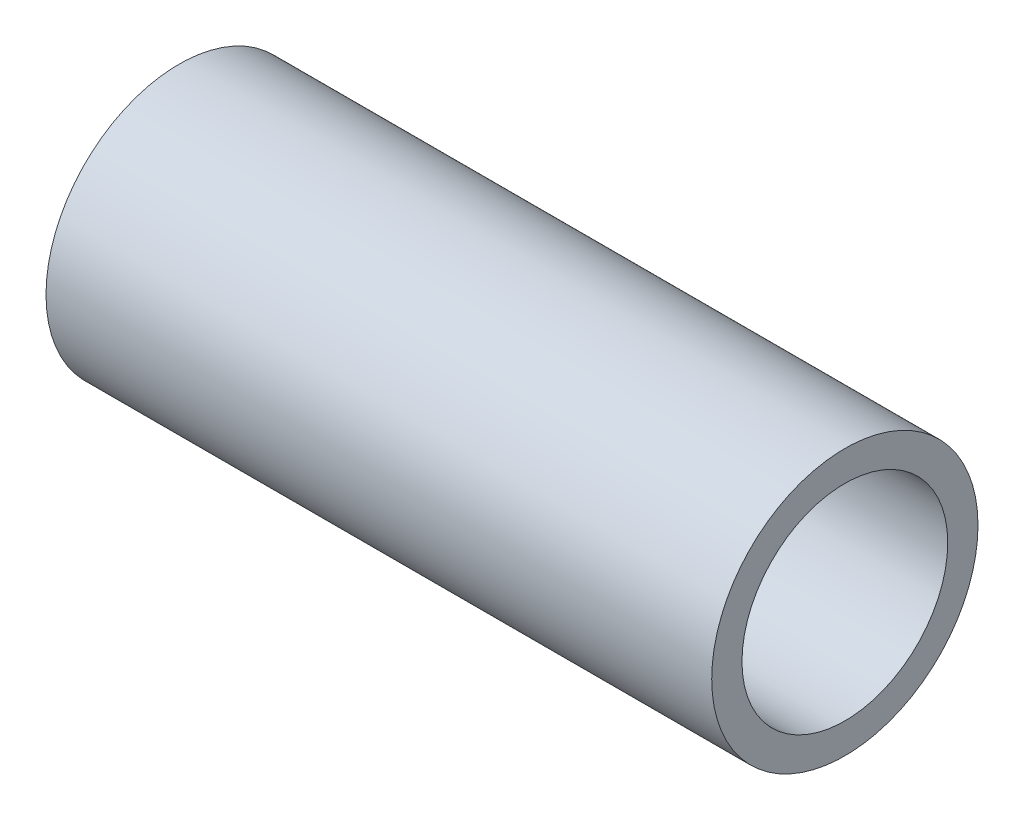
ISO-10303-21;
HEADER;
FILE_DESCRIPTION(('STEP AP214'),'2;1');
FILE_NAME('part.step','',(''),(''),'','','');
FILE_SCHEMA(('AUTOMOTIVE_DESIGN { 1 0 10303 214 1 1 1 1 }'));
ENDSEC;
DATA;
#1=APPLICATION_CONTEXT('core data for automotive mechanical design processes');
#2=APPLICATION_PROTOCOL_DEFINITION('international standard','automotive_design',2000,#1);
#3=PRODUCT_CONTEXT('',#1,'mechanical');
#4=PRODUCT('Part','Part','',(#3));
#5=PRODUCT_RELATED_PRODUCT_CATEGORY('part','',(#4));
#6=PRODUCT_DEFINITION_FORMATION('','',#4);
#7=PRODUCT_DEFINITION_CONTEXT('part definition',#1,'design');
#8=PRODUCT_DEFINITION('design','',#6,#7);
#9=PRODUCT_DEFINITION_SHAPE('','',#8);
#10=(LENGTH_UNIT() NAMED_UNIT(*) SI_UNIT(.MILLI.,.METRE.));
#11=(NAMED_UNIT(*) PLANE_ANGLE_UNIT() SI_UNIT($,.RADIAN.));
#12=(NAMED_UNIT(*) SI_UNIT($,.STERADIAN.) SOLID_ANGLE_UNIT());
#13=UNCERTAINTY_MEASURE_WITH_UNIT(LENGTH_MEASURE(1.E-05),#10,'distance_accuracy_value','');
#14=(GEOMETRIC_REPRESENTATION_CONTEXT(3) GLOBAL_UNCERTAINTY_ASSIGNED_CONTEXT((#13)) GLOBAL_UNIT_ASSIGNED_CONTEXT((#10,
#11,#12)) REPRESENTATION_CONTEXT('',''));
#15=CARTESIAN_POINT('',(0.,0.,0.));
#16=DIRECTION('',(0.,0.,1.));
#17=DIRECTION('',(1.,0.,0.));
#18=AXIS2_PLACEMENT_3D('',#15,#16,#17);
#19=CARTESIAN_POINT('',(55.,0.,0.));
#20=DIRECTION('',(1.,0.,0.));
#21=DIRECTION('',(0.,0.,-1.));
#22=AXIS2_PLACEMENT_3D('',#19,#20,#21);
#23=PLANE('',#22);
#24=CARTESIAN_POINT('',(55.,0.,0.));
#25=DIRECTION('',(1.,0.,0.));
#26=DIRECTION('',(0.,0.,-1.));
#27=AXIS2_PLACEMENT_3D('',#24,#25,#26);
#28=CIRCLE('',#27,11.);
#29=CARTESIAN_POINT('',(55.,0.,-11.));
#30=VERTEX_POINT('',#29);
#31=EDGE_CURVE('E10',#30,#30,#28,.T.);
#32=ORIENTED_EDGE('',*,*,#31,.T.);
#33=EDGE_LOOP('',(#32));
#34=FACE_BOUND('',#33,.T.);
#35=CARTESIAN_POINT('',(55.,0.,0.));
#36=DIRECTION('',(1.,0.,0.));
#37=DIRECTION('',(0.,0.,-1.));
#38=AXIS2_PLACEMENT_3D('',#35,#36,#37);
#39=CIRCLE('',#38,8.5);
#40=CARTESIAN_POINT('',(55.,0.,-8.5));
#41=VERTEX_POINT('',#40);
#42=EDGE_CURVE('E41',#41,#41,#39,.T.);
#43=ORIENTED_EDGE('',*,*,#42,.F.);
#44=EDGE_LOOP('',(#43));
#45=FACE_BOUND('',#44,.T.);
#46=ADVANCED_FACE('F30',(#34,#45),#23,.T.);
#47=CARTESIAN_POINT('',(0.,0.,0.));
#48=DIRECTION('',(1.,0.,0.));
#49=DIRECTION('',(0.,0.,-1.));
#50=AXIS2_PLACEMENT_3D('',#47,#48,#49);
#51=PLANE('',#50);
#52=CARTESIAN_POINT('',(0.,0.,0.));
#53=DIRECTION('',(1.,0.,0.));
#54=DIRECTION('',(0.,0.,-1.));
#55=AXIS2_PLACEMENT_3D('',#52,#53,#54);
#56=CIRCLE('',#55,11.);
#57=CARTESIAN_POINT('',(0.,0.,-11.));
#58=VERTEX_POINT('',#57);
#59=EDGE_CURVE('E34',#58,#58,#56,.T.);
#60=ORIENTED_EDGE('',*,*,#59,.F.);
#61=EDGE_LOOP('',(#60));
#62=FACE_BOUND('',#61,.T.);
#63=CARTESIAN_POINT('',(0.,0.,0.));
#64=DIRECTION('',(1.,0.,0.));
#65=DIRECTION('',(0.,0.,-1.));
#66=AXIS2_PLACEMENT_3D('',#63,#64,#65);
#67=CIRCLE('',#66,8.5);
#68=CARTESIAN_POINT('',(0.,0.,-8.5));
#69=VERTEX_POINT('',#68);
#70=EDGE_CURVE('E43',#69,#69,#67,.T.);
#71=ORIENTED_EDGE('',*,*,#70,.T.);
#72=EDGE_LOOP('',(#71));
#73=FACE_BOUND('',#72,.T.);
#74=ADVANCED_FACE('F53',(#62,#73),#51,.F.);
#75=CARTESIAN_POINT('',(55.,0.,0.));
#76=DIRECTION('',(-1.,0.,0.));
#77=DIRECTION('',(0.,0.,1.));
#78=AXIS2_PLACEMENT_3D('',#75,#76,#77);
#79=CYLINDRICAL_SURFACE('',#78,11.);
#80=ORIENTED_EDGE('',*,*,#31,.F.);
#81=EDGE_LOOP('',(#80));
#82=FACE_BOUND('',#81,.T.);
#83=ORIENTED_EDGE('',*,*,#59,.T.);
#84=EDGE_LOOP('',(#83));
#85=FACE_BOUND('',#84,.T.);
#86=ADVANCED_FACE('F32',(#82,#85),#79,.T.);
#87=CARTESIAN_POINT('',(55.,0.,0.));
#88=DIRECTION('',(-1.,0.,0.));
#89=DIRECTION('',(0.,0.,1.));
#90=AXIS2_PLACEMENT_3D('',#87,#88,#89);
#91=CYLINDRICAL_SURFACE('',#90,8.5);
#92=ORIENTED_EDGE('',*,*,#42,.T.);
#93=EDGE_LOOP('',(#92));
#94=FACE_BOUND('',#93,.T.);
#95=ORIENTED_EDGE('',*,*,#70,.F.);
#96=EDGE_LOOP('',(#95));
#97=FACE_BOUND('',#96,.T.);
#98=ADVANCED_FACE('F49',(#94,#97),#91,.F.);
#99=CLOSED_SHELL('',(#46,#74,#86,#98));
#100=MANIFOLD_SOLID_BREP('B2',#99);
#101=ADVANCED_BREP_SHAPE_REPRESENTATION('',(#18,#100),#14);
#102=SHAPE_DEFINITION_REPRESENTATION(#9,#101);
ENDSEC;
END-ISO-10303-21;
